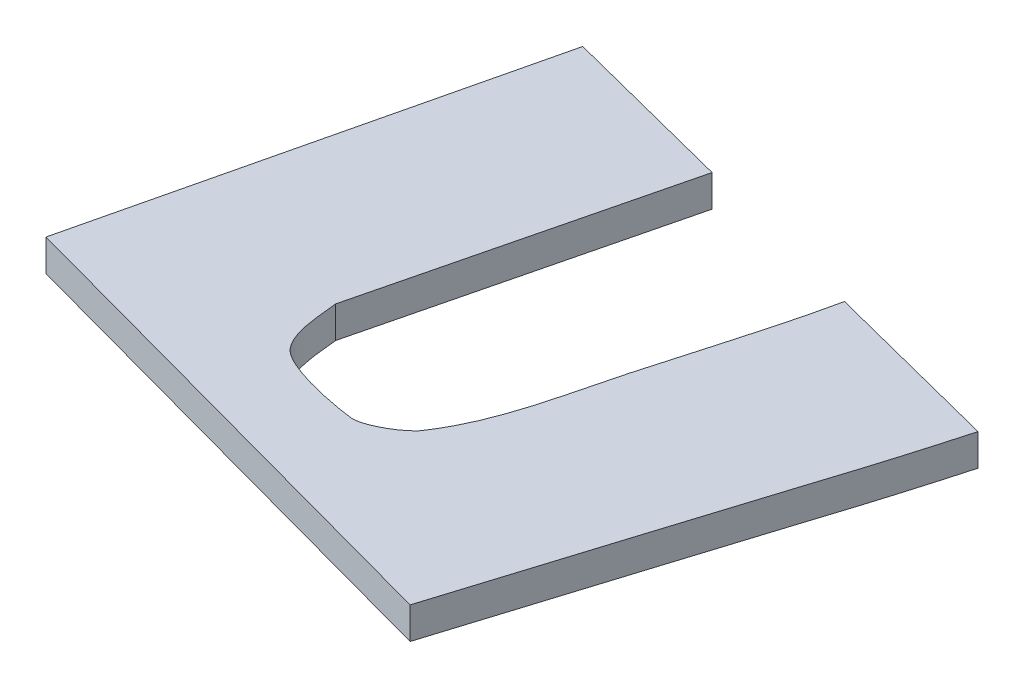
ISO-10303-21;
HEADER;
FILE_DESCRIPTION(('STEP AP214'),'2;1');
FILE_NAME('part.step','',(''),(''),'','','');
FILE_SCHEMA(('AUTOMOTIVE_DESIGN { 1 0 10303 214 1 1 1 1 }'));
ENDSEC;
DATA;
#1=APPLICATION_CONTEXT('core data for automotive mechanical design processes');
#2=APPLICATION_PROTOCOL_DEFINITION('international standard','automotive_design',2000,#1);
#3=PRODUCT_CONTEXT('',#1,'mechanical');
#4=PRODUCT('Part','Part','',(#3));
#5=PRODUCT_RELATED_PRODUCT_CATEGORY('part','',(#4));
#6=PRODUCT_DEFINITION_FORMATION('','',#4);
#7=PRODUCT_DEFINITION_CONTEXT('part definition',#1,'design');
#8=PRODUCT_DEFINITION('design','',#6,#7);
#9=PRODUCT_DEFINITION_SHAPE('','',#8);
#10=(LENGTH_UNIT() NAMED_UNIT(*) SI_UNIT(.MILLI.,.METRE.));
#11=(NAMED_UNIT(*) PLANE_ANGLE_UNIT() SI_UNIT($,.RADIAN.));
#12=(NAMED_UNIT(*) SI_UNIT($,.STERADIAN.) SOLID_ANGLE_UNIT());
#13=UNCERTAINTY_MEASURE_WITH_UNIT(LENGTH_MEASURE(1.E-05),#10,'distance_accuracy_value','');
#14=(GEOMETRIC_REPRESENTATION_CONTEXT(3) GLOBAL_UNCERTAINTY_ASSIGNED_CONTEXT((#13)) GLOBAL_UNIT_ASSIGNED_CONTEXT((#10,
#11,#12)) REPRESENTATION_CONTEXT('',''));
#15=CARTESIAN_POINT('',(0.,0.,0.));
#16=DIRECTION('',(0.,0.,1.));
#17=DIRECTION('',(1.,0.,0.));
#18=AXIS2_PLACEMENT_3D('',#15,#16,#17);
#19=CARTESIAN_POINT('',(23.4183395472429,1.,24.0051376543351));
#20=CARTESIAN_POINT('',(23.490375251129,1.,24.5814232854239));
#21=CARTESIAN_POINT('',(23.5045682979458,1.,25.4769982545996));
#22=CARTESIAN_POINT('',(23.9397904059945,1.,25.9605783746537));
#23=CARTESIAN_POINT('',(24.4442832609816,1.,26.521125991306));
#24=CARTESIAN_POINT('',(26.4958328795922,1.,26.8582632227292));
#25=CARTESIAN_POINT('',(26.8077701291285,1.,26.8731173774691));
#26=CARTESIAN_POINT('',(27.2093199998308,1.,26.8922387998835));
#27=CARTESIAN_POINT('',(28.0279396735729,1.,26.4116715650255));
#28=CARTESIAN_POINT('',(28.2417599906955,1.,26.0909410893416));
#29=CARTESIAN_POINT('',(29.2030043715984,1.,24.6490745179873));
#30=CARTESIAN_POINT('',(29.4951320131321,1.,22.8857792970785));
#31=CARTESIAN_POINT('',(29.9364752816383,1.,21.267520645889));
#32=CARTESIAN_POINT('',(30.4208502813029,1.,19.4914789804523));
#33=CARTESIAN_POINT('',(30.9771878105426,1.,17.7579435627775));
#34=CARTESIAN_POINT('',(31.3704651432053,1.,15.9226493436847));
#35=B_SPLINE_CURVE_WITH_KNOTS('',3,(#19,#20,#21,#22,#23,#24,#25,#26,#27,#28,#29,#30,#31,#32,#33,
#34),.UNSPECIFIED.,.F.,.F.,(4,3,3,3,3,4),(0.,1.,2.,3.,4.,5.),.UNSPECIFIED.);
#36=DIRECTION('',(0.,-1.,0.));
#37=VECTOR('',#36,1.);
#38=SURFACE_OF_LINEAR_EXTRUSION('',#35,#37);
#39=CARTESIAN_POINT('',(23.4183395472429,0.,24.0051376543351));
#40=CARTESIAN_POINT('',(23.490375251129,0.,24.5814232854239));
#41=CARTESIAN_POINT('',(23.5045682979458,0.,25.4769982545996));
#42=CARTESIAN_POINT('',(23.9397904059945,0.,25.9605783746537));
#43=CARTESIAN_POINT('',(24.4442832609816,0.,26.521125991306));
#44=CARTESIAN_POINT('',(26.4958328795922,0.,26.8582632227292));
#45=CARTESIAN_POINT('',(26.8077701291285,0.,26.8731173774691));
#46=CARTESIAN_POINT('',(27.2093199998308,0.,26.8922387998835));
#47=CARTESIAN_POINT('',(28.0279396735729,0.,26.4116715650255));
#48=CARTESIAN_POINT('',(28.2417599906955,0.,26.0909410893416));
#49=CARTESIAN_POINT('',(29.2030043715984,0.,24.6490745179873));
#50=CARTESIAN_POINT('',(29.4951320131321,0.,22.8857792970785));
#51=CARTESIAN_POINT('',(29.9364752816383,0.,21.267520645889));
#52=CARTESIAN_POINT('',(30.4208502813029,0.,19.4914789804523));
#53=CARTESIAN_POINT('',(30.9771878105426,0.,17.7579435627775));
#54=CARTESIAN_POINT('',(31.3704651432053,0.,15.9226493436847));
#55=B_SPLINE_CURVE_WITH_KNOTS('',3,(#39,#40,#41,#42,#43,#44,#45,#46,#47,#48,#49,#50,#51,#52,#53,
#54),.UNSPECIFIED.,.F.,.F.,(4,3,3,3,3,4),(0.,1.,2.,3.,4.,5.),.UNSPECIFIED.);
#56=CARTESIAN_POINT('',(23.4183395472429,0.,24.0051376543351));
#57=VERTEX_POINT('',#56);
#58=CARTESIAN_POINT('',(31.3704651432053,0.,15.9226493436847));
#59=VERTEX_POINT('',#58);
#60=EDGE_CURVE('E72',#57,#59,#55,.T.);
#61=ORIENTED_EDGE('',*,*,#60,.F.);
#62=DIRECTION('',(0.,-1.,0.));
#63=VECTOR('',#62,1.);
#64=CARTESIAN_POINT('',(23.4183395472429,1.,24.0051376543351));
#65=LINE('',#64,#63);
#66=CARTESIAN_POINT('',(23.4183395472429,1.,24.0051376543351));
#67=VERTEX_POINT('',#66);
#68=EDGE_CURVE('E120',#67,#57,#65,.T.);
#69=ORIENTED_EDGE('',*,*,#68,.F.);
#70=CARTESIAN_POINT('',(31.3704651432052,1.,15.9226493436847));
#71=VERTEX_POINT('',#70);
#72=EDGE_CURVE('E150',#67,#71,#35,.T.);
#73=ORIENTED_EDGE('',*,*,#72,.T.);
#74=DIRECTION('',(0.,-1.,0.));
#75=VECTOR('',#74,1.);
#76=CARTESIAN_POINT('',(31.3704651432053,1.,15.9226493436847));
#77=LINE('',#76,#75);
#78=EDGE_CURVE('E158',#71,#59,#77,.T.);
#79=ORIENTED_EDGE('',*,*,#78,.T.);
#80=EDGE_LOOP('',(#61,#69,#73,#79));
#81=FACE_BOUND('',#80,.T.);
#82=ADVANCED_FACE('F39',(#81),#38,.T.);
#83=CARTESIAN_POINT('',(23.4183395472429,1.,24.0051376543351));
#84=DIRECTION('',(0.970919821530487,0.,0.239404887500668));
#85=DIRECTION('',(0.239404887500668,0.,-0.970919821530487));
#86=AXIS2_PLACEMENT_3D('',#83,#84,#85);
#87=PLANE('',#86);
#88=DIRECTION('',(-0.239404887500668,0.,0.970919821530487));
#89=VECTOR('',#88,1.);
#90=CARTESIAN_POINT('',(23.4183395472429,0.,24.0051376543351));
#91=LINE('',#90,#89);
#92=CARTESIAN_POINT('',(25.7648684116253,0.,14.4886594821178));
#93=VERTEX_POINT('',#92);
#94=EDGE_CURVE('E109',#93,#57,#91,.T.);
#95=ORIENTED_EDGE('',*,*,#94,.F.);
#96=DIRECTION('',(0.,-1.,0.));
#97=VECTOR('',#96,1.);
#98=CARTESIAN_POINT('',(25.7648684116253,1.,14.4886594821178));
#99=LINE('',#98,#97);
#100=CARTESIAN_POINT('',(25.7648684116253,1.,14.4886594821178));
#101=VERTEX_POINT('',#100);
#102=EDGE_CURVE('E159',#101,#93,#99,.T.);
#103=ORIENTED_EDGE('',*,*,#102,.F.);
#104=DIRECTION('',(-0.239404887500668,0.,0.970919821530487));
#105=VECTOR('',#104,1.);
#106=CARTESIAN_POINT('',(23.4183395472429,1.,24.0051376543351));
#107=LINE('',#106,#105);
#108=EDGE_CURVE('E123',#101,#67,#107,.T.);
#109=ORIENTED_EDGE('',*,*,#108,.T.);
#110=ORIENTED_EDGE('',*,*,#68,.T.);
#111=EDGE_LOOP('',(#95,#103,#109,#110));
#112=FACE_BOUND('',#111,.T.);
#113=ADVANCED_FACE('F143',(#112),#87,.T.);
#114=CARTESIAN_POINT('',(32.8044550047723,1.,31.0447242474821));
#115=DIRECTION('',(0.263117405792108,0.,-0.964763821237732));
#116=DIRECTION('',(-0.964763821237732,0.,-0.263117405792108));
#117=AXIS2_PLACEMENT_3D('',#114,#115,#116);
#118=PLANE('',#117);
#119=DIRECTION('',(0.964763821237732,0.,0.263117405792108));
#120=VECTOR('',#119,1.);
#121=CARTESIAN_POINT('',(32.8044550047723,0.,31.0447242474821));
#122=LINE('',#121,#120);
#123=CARTESIAN_POINT('',(17.0305665275354,0.,26.7427546627812));
#124=VERTEX_POINT('',#123);
#125=CARTESIAN_POINT('',(32.8044550047723,0.,31.0447242474821));
#126=VERTEX_POINT('',#125);
#127=EDGE_CURVE('E92',#124,#126,#122,.T.);
#128=ORIENTED_EDGE('',*,*,#127,.T.);
#129=DIRECTION('',(0.,-1.,0.));
#130=VECTOR('',#129,1.);
#131=CARTESIAN_POINT('',(32.8044550047723,1.,31.0447242474821));
#132=LINE('',#131,#130);
#133=CARTESIAN_POINT('',(32.8044550047723,1.,31.0447242474821));
#134=VERTEX_POINT('',#133);
#135=EDGE_CURVE('E110',#134,#126,#132,.T.);
#136=ORIENTED_EDGE('',*,*,#135,.F.);
#137=DIRECTION('',(0.964763821237732,0.,0.263117405792108));
#138=VECTOR('',#137,1.);
#139=CARTESIAN_POINT('',(32.8044550047723,1.,31.0447242474821));
#140=LINE('',#139,#138);
#141=CARTESIAN_POINT('',(17.0305665275354,1.,26.7427546627812));
#142=VERTEX_POINT('',#141);
#143=EDGE_CURVE('E52',#142,#134,#140,.T.);
#144=ORIENTED_EDGE('',*,*,#143,.F.);
#145=DIRECTION('',(0.,-1.,0.));
#146=VECTOR('',#145,1.);
#147=CARTESIAN_POINT('',(17.0305665275354,1.,26.7427546627812));
#148=LINE('',#147,#146);
#149=EDGE_CURVE('E102',#142,#124,#148,.T.);
#150=ORIENTED_EDGE('',*,*,#149,.T.);
#151=EDGE_LOOP('',(#128,#136,#144,#150));
#152=FACE_BOUND('',#151,.T.);
#153=ADVANCED_FACE('F112',(#152),#118,.F.);
#154=CARTESIAN_POINT('',(32.8044550047723,1.,31.0447242474821));
#155=CARTESIAN_POINT('',(33.8908109605049,1.,27.5683851891379));
#156=CARTESIAN_POINT('',(34.9627117890836,1.,24.0874958723219));
#157=CARTESIAN_POINT('',(36.06352287197,1.,20.6157070724495));
#158=CARTESIAN_POINT('',(37.5703053882893,1.,15.8635468286734));
#159=CARTESIAN_POINT('',(38.6036794098577,1.,10.9739985456176));
#160=CARTESIAN_POINT('',(39.8440415979194,1.,6.14544574209162));
#161=B_SPLINE_CURVE_WITH_KNOTS('',3,(#154,#155,#156,#157,#158,#159,#160),.UNSPECIFIED.,.F.,.F.,
(4,3,4),(0.,1.,2.),.UNSPECIFIED.);
#162=DIRECTION('',(0.,-1.,0.));
#163=VECTOR('',#162,1.);
#164=SURFACE_OF_LINEAR_EXTRUSION('',#161,#163);
#165=CARTESIAN_POINT('',(32.8044550047723,0.,31.0447242474821));
#166=CARTESIAN_POINT('',(33.8908109605049,0.,27.5683851891379));
#167=CARTESIAN_POINT('',(34.9627117890836,0.,24.0874958723219));
#168=CARTESIAN_POINT('',(36.06352287197,0.,20.6157070724495));
#169=CARTESIAN_POINT('',(37.5703053882893,0.,15.8635468286734));
#170=CARTESIAN_POINT('',(38.6036794098577,0.,10.9739985456176));
#171=CARTESIAN_POINT('',(39.8440415979194,0.,6.14544574209162));
#172=B_SPLINE_CURVE_WITH_KNOTS('',3,(#165,#166,#167,#168,#169,#170,#171),.UNSPECIFIED.,.F.,.F.,
(4,3,4),(0.,1.,2.),.UNSPECIFIED.);
#173=CARTESIAN_POINT('',(37.0222397814744,0.,17.3684521581257));
#174=VERTEX_POINT('',#173);
#175=EDGE_CURVE('E114',#126,#174,#172,.T.);
#176=ORIENTED_EDGE('',*,*,#175,.T.);
#177=DIRECTION('',(0.,1.,0.));
#178=VECTOR('',#177,1.);
#179=CARTESIAN_POINT('',(37.0222397814744,-9.,17.3684521581257));
#180=LINE('',#179,#178);
#181=CARTESIAN_POINT('',(37.0222397814744,1.,17.3684521581257));
#182=VERTEX_POINT('',#181);
#183=EDGE_CURVE('E196',#174,#182,#180,.T.);
#184=ORIENTED_EDGE('',*,*,#183,.T.);
#185=EDGE_CURVE('E11',#134,#182,#161,.T.);
#186=ORIENTED_EDGE('',*,*,#185,.F.);
#187=ORIENTED_EDGE('',*,*,#135,.T.);
#188=EDGE_LOOP('',(#176,#184,#186,#187));
#189=FACE_BOUND('',#188,.T.);
#190=ADVANCED_FACE('F137',(#189),#164,.F.);
#191=CARTESIAN_POINT('',(17.0305665275354,1.,26.7427546627812));
#192=DIRECTION('',(0.972725871839391,0.,0.231957707900162));
#193=DIRECTION('',(0.231957707900162,0.,-0.972725871839391));
#194=AXIS2_PLACEMENT_3D('',#191,#192,#193);
#195=PLANE('',#194);
#196=DIRECTION('',(-0.231957707900162,0.,0.972725871839391));
#197=VECTOR('',#196,1.);
#198=CARTESIAN_POINT('',(17.0305665275354,1.,26.7427546627812));
#199=LINE('',#198,#197);
#200=CARTESIAN_POINT('',(20.2868649288672,1.,13.0873097539704));
#201=VERTEX_POINT('',#200);
#202=EDGE_CURVE('E166',#201,#142,#199,.T.);
#203=ORIENTED_EDGE('',*,*,#202,.F.);
#204=DIRECTION('',(0.,1.,0.));
#205=VECTOR('',#204,1.);
#206=CARTESIAN_POINT('',(20.2868649288672,-9.,13.0873097539704));
#207=LINE('',#206,#205);
#208=CARTESIAN_POINT('',(20.2868649288672,0.,13.0873097539704));
#209=VERTEX_POINT('',#208);
#210=EDGE_CURVE('E105',#209,#201,#207,.T.);
#211=ORIENTED_EDGE('',*,*,#210,.F.);
#212=DIRECTION('',(-0.231957707900162,0.,0.972725871839391));
#213=VECTOR('',#212,1.);
#214=CARTESIAN_POINT('',(17.0305665275354,0.,26.7427546627812));
#215=LINE('',#214,#213);
#216=EDGE_CURVE('E99',#209,#124,#215,.T.);
#217=ORIENTED_EDGE('',*,*,#216,.T.);
#218=ORIENTED_EDGE('',*,*,#149,.F.);
#219=EDGE_LOOP('',(#203,#211,#217,#218));
#220=FACE_BOUND('',#219,.T.);
#221=ADVANCED_FACE('F101',(#220),#195,.F.);
#222=CARTESIAN_POINT('',(62.4947593620138,0.,-34.1363669338565));
#223=DIRECTION('',(0.,1.,0.));
#224=DIRECTION('',(0.,0.,1.));
#225=AXIS2_PLACEMENT_3D('',#222,#223,#224);
#226=PLANE('',#225);
#227=ORIENTED_EDGE('',*,*,#216,.F.);
#228=DIRECTION('',(0.968802704477566,0.,0.247833249982632));
#229=VECTOR('',#228,1.);
#230=CARTESIAN_POINT('',(48.5638180931038,0.,20.3209489355192));
#231=LINE('',#230,#229);
#232=EDGE_CURVE('E177',#209,#93,#231,.T.);
#233=ORIENTED_EDGE('',*,*,#232,.T.);
#234=ORIENTED_EDGE('',*,*,#94,.T.);
#235=ORIENTED_EDGE('',*,*,#60,.T.);
#236=EDGE_CURVE('E83',#59,#174,#231,.T.);
#237=ORIENTED_EDGE('',*,*,#236,.T.);
#238=ORIENTED_EDGE('',*,*,#175,.F.);
#239=ORIENTED_EDGE('',*,*,#127,.F.);
#240=EDGE_LOOP('',(#227,#233,#234,#235,#237,#238,#239));
#241=FACE_BOUND('',#240,.T.);
#242=ADVANCED_FACE('F117',(#241),#226,.F.);
#243=CARTESIAN_POINT('',(62.4947593620138,1.,-34.1363669338565));
#244=DIRECTION('',(0.,1.,0.));
#245=DIRECTION('',(0.,0.,1.));
#246=AXIS2_PLACEMENT_3D('',#243,#244,#245);
#247=PLANE('',#246);
#248=DIRECTION('',(0.968802704477566,0.,0.247833249982632));
#249=VECTOR('',#248,1.);
#250=CARTESIAN_POINT('',(37.0222397814744,1.,17.3684521581257));
#251=LINE('',#250,#249);
#252=EDGE_CURVE('E194',#201,#101,#251,.T.);
#253=ORIENTED_EDGE('',*,*,#252,.F.);
#254=ORIENTED_EDGE('',*,*,#202,.T.);
#255=ORIENTED_EDGE('',*,*,#143,.T.);
#256=ORIENTED_EDGE('',*,*,#185,.T.);
#257=EDGE_CURVE('E200',#71,#182,#251,.T.);
#258=ORIENTED_EDGE('',*,*,#257,.F.);
#259=ORIENTED_EDGE('',*,*,#72,.F.);
#260=ORIENTED_EDGE('',*,*,#108,.F.);
#261=EDGE_LOOP('',(#253,#254,#255,#256,#258,#259,#260));
#262=FACE_BOUND('',#261,.T.);
#263=ADVANCED_FACE('F41',(#262),#247,.T.);
#264=CARTESIAN_POINT('',(37.0222397814744,-9.,17.3684521581257));
#265=DIRECTION('',(-0.247833249982632,0.,0.968802704477566));
#266=DIRECTION('',(0.968802704477566,0.,0.247833249982632));
#267=AXIS2_PLACEMENT_3D('',#264,#265,#266);
#268=PLANE('',#267);
#269=ORIENTED_EDGE('',*,*,#210,.T.);
#270=ORIENTED_EDGE('',*,*,#252,.T.);
#271=ORIENTED_EDGE('',*,*,#102,.T.);
#272=ORIENTED_EDGE('',*,*,#232,.F.);
#273=EDGE_LOOP('',(#269,#270,#271,#272));
#274=FACE_BOUND('',#273,.T.);
#275=ADVANCED_FACE('F193',(#274),#268,.F.);
#276=ORIENTED_EDGE('',*,*,#78,.F.);
#277=ORIENTED_EDGE('',*,*,#257,.T.);
#278=ORIENTED_EDGE('',*,*,#183,.F.);
#279=ORIENTED_EDGE('',*,*,#236,.F.);
#280=EDGE_LOOP('',(#276,#277,#278,#279));
#281=FACE_BOUND('',#280,.T.);
#282=ADVANCED_FACE('F215',(#281),#268,.F.);
#283=CLOSED_SHELL('',(#82,#113,#153,#190,#221,#242,#263,#275,#282));
#284=MANIFOLD_SOLID_BREP('B2',#283);
#285=ADVANCED_BREP_SHAPE_REPRESENTATION('',(#18,#284),#14);
#286=SHAPE_DEFINITION_REPRESENTATION(#9,#285);
ENDSEC;
END-ISO-10303-21;
